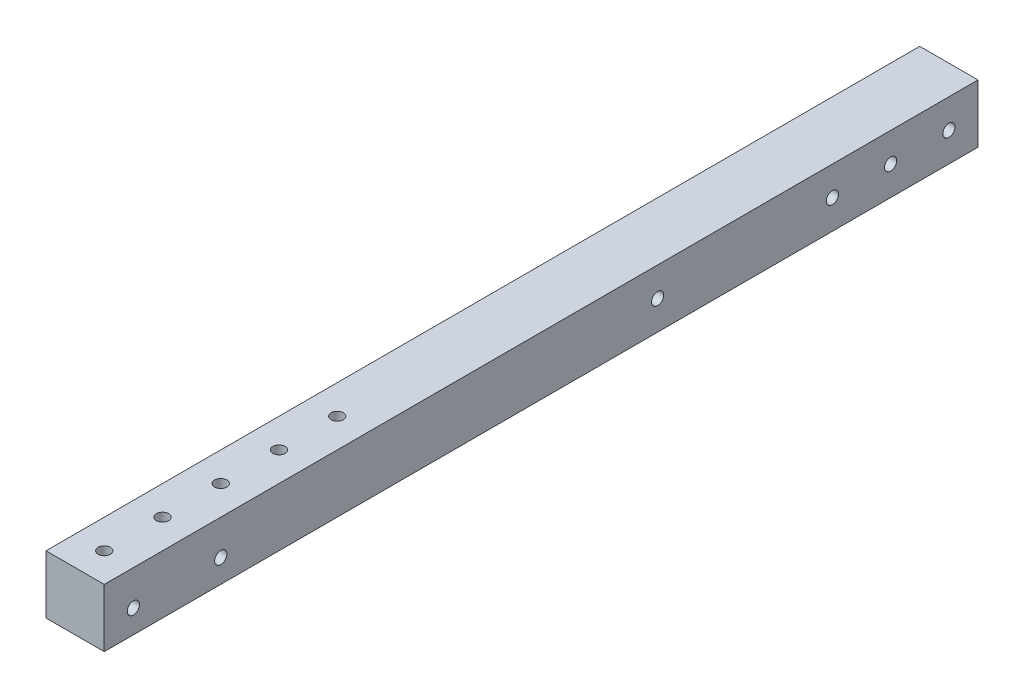
ISO-10303-21;
HEADER;
FILE_DESCRIPTION(('STEP AP214'),'2;1');
FILE_NAME('part.step','',(''),(''),'','','');
FILE_SCHEMA(('AUTOMOTIVE_DESIGN { 1 0 10303 214 1 1 1 1 }'));
ENDSEC;
DATA;
#1=APPLICATION_CONTEXT('core data for automotive mechanical design processes');
#2=APPLICATION_PROTOCOL_DEFINITION('international standard','automotive_design',2000,#1);
#3=PRODUCT_CONTEXT('',#1,'mechanical');
#4=PRODUCT('Part','Part','',(#3));
#5=PRODUCT_RELATED_PRODUCT_CATEGORY('part','',(#4));
#6=PRODUCT_DEFINITION_FORMATION('','',#4);
#7=PRODUCT_DEFINITION_CONTEXT('part definition',#1,'design');
#8=PRODUCT_DEFINITION('design','',#6,#7);
#9=PRODUCT_DEFINITION_SHAPE('','',#8);
#10=(LENGTH_UNIT() NAMED_UNIT(*) SI_UNIT(.MILLI.,.METRE.));
#11=(NAMED_UNIT(*) PLANE_ANGLE_UNIT() SI_UNIT($,.RADIAN.));
#12=(NAMED_UNIT(*) SI_UNIT($,.STERADIAN.) SOLID_ANGLE_UNIT());
#13=UNCERTAINTY_MEASURE_WITH_UNIT(LENGTH_MEASURE(1.E-05),#10,'distance_accuracy_value','');
#14=(GEOMETRIC_REPRESENTATION_CONTEXT(3) GLOBAL_UNCERTAINTY_ASSIGNED_CONTEXT((#13)) GLOBAL_UNIT_ASSIGNED_CONTEXT((#10,
#11,#12)) REPRESENTATION_CONTEXT('',''));
#15=CARTESIAN_POINT('',(0.,0.,0.));
#16=DIRECTION('',(0.,0.,1.));
#17=DIRECTION('',(1.,0.,0.));
#18=AXIS2_PLACEMENT_3D('',#15,#16,#17);
#19=CARTESIAN_POINT('',(0.,10.,290.));
#20=DIRECTION('',(0.,-1.,0.));
#21=DIRECTION('',(0.,0.,-1.));
#22=AXIS2_PLACEMENT_3D('',#19,#20,#21);
#23=CYLINDRICAL_SURFACE('',#22,2.1);
#24=CARTESIAN_POINT('',(0.,-10.,290.));
#25=DIRECTION('',(0.,-1.,0.));
#26=DIRECTION('',(0.,0.,-1.));
#27=AXIS2_PLACEMENT_3D('',#24,#25,#26);
#28=CIRCLE('',#27,2.1);
#29=CARTESIAN_POINT('',(0.,-10.,287.9));
#30=VERTEX_POINT('',#29);
#31=EDGE_CURVE('E196',#30,#30,#28,.T.);
#32=ORIENTED_EDGE('',*,*,#31,.T.);
#33=EDGE_LOOP('',(#32));
#34=FACE_BOUND('',#33,.T.);
#35=CARTESIAN_POINT('',(0.,-2.,290.));
#36=DIRECTION('',(-0.707106781186547,-0.707106781186547,0.));
#37=DIRECTION('',(0.707106781186547,-0.707106781186547,0.));
#38=AXIS2_PLACEMENT_3D('',#35,#36,#37);
#39=ELLIPSE('',#38,2.96984848098349,2.09999999999999);
#40=CARTESIAN_POINT('',(0.,-2.,292.1));
#41=VERTEX_POINT('',#40);
#42=CARTESIAN_POINT('',(0.,-2.,287.9));
#43=VERTEX_POINT('',#42);
#44=EDGE_CURVE('E53',#41,#43,#39,.F.);
#45=ORIENTED_EDGE('',*,*,#44,.T.);
#46=CARTESIAN_POINT('',(0.,-2.,290.));
#47=DIRECTION('',(0.707106781186547,-0.707106781186547,0.));
#48=DIRECTION('',(-0.707106781186547,-0.707106781186547,0.));
#49=AXIS2_PLACEMENT_3D('',#46,#47,#48);
#50=ELLIPSE('',#49,2.96984848098349,2.09999999999999);
#51=EDGE_CURVE('E11',#43,#41,#50,.F.);
#52=ORIENTED_EDGE('',*,*,#51,.T.);
#53=EDGE_LOOP('',(#45,#52));
#54=FACE_BOUND('',#53,.T.);
#55=ADVANCED_FACE('F39',(#34,#54),#23,.F.);
#56=CARTESIAN_POINT('',(10.,10.,300.));
#57=DIRECTION('',(-1.,0.,0.));
#58=DIRECTION('',(0.,0.,1.));
#59=AXIS2_PLACEMENT_3D('',#56,#57,#58);
#60=PLANE('',#59);
#61=CARTESIAN_POINT('',(10.,-2.,290.));
#62=DIRECTION('',(1.,0.,0.));
#63=DIRECTION('',(0.,0.,-1.));
#64=AXIS2_PLACEMENT_3D('',#61,#62,#63);
#65=CIRCLE('',#64,2.09999999999999);
#66=CARTESIAN_POINT('',(10.,-2.,287.9));
#67=VERTEX_POINT('',#66);
#68=EDGE_CURVE('E227',#67,#67,#65,.T.);
#69=ORIENTED_EDGE('',*,*,#68,.F.);
#70=EDGE_LOOP('',(#69));
#71=FACE_BOUND('',#70,.T.);
#72=CARTESIAN_POINT('',(10.,-2.,260.));
#73=DIRECTION('',(1.,0.,0.));
#74=DIRECTION('',(0.,0.,-1.));
#75=AXIS2_PLACEMENT_3D('',#72,#73,#74);
#76=CIRCLE('',#75,2.09999999999999);
#77=CARTESIAN_POINT('',(10.,-2.,257.9));
#78=VERTEX_POINT('',#77);
#79=EDGE_CURVE('E219',#78,#78,#76,.T.);
#80=ORIENTED_EDGE('',*,*,#79,.F.);
#81=EDGE_LOOP('',(#80));
#82=FACE_BOUND('',#81,.T.);
#83=CARTESIAN_POINT('',(10.,0.,50.));
#84=DIRECTION('',(1.,0.,0.));
#85=DIRECTION('',(0.,0.,-1.));
#86=AXIS2_PLACEMENT_3D('',#83,#84,#85);
#87=CIRCLE('',#86,2.1);
#88=CARTESIAN_POINT('',(10.,0.,47.9));
#89=VERTEX_POINT('',#88);
#90=EDGE_CURVE('E171',#89,#89,#87,.T.);
#91=ORIENTED_EDGE('',*,*,#90,.F.);
#92=EDGE_LOOP('',(#91));
#93=FACE_BOUND('',#92,.T.);
#94=CARTESIAN_POINT('',(10.,0.,110.));
#95=DIRECTION('',(1.,0.,0.));
#96=DIRECTION('',(0.,0.,-1.));
#97=AXIS2_PLACEMENT_3D('',#94,#95,#96);
#98=CIRCLE('',#97,2.09999999999999);
#99=CARTESIAN_POINT('',(10.,0.,107.9));
#100=VERTEX_POINT('',#99);
#101=EDGE_CURVE('E163',#100,#100,#98,.T.);
#102=ORIENTED_EDGE('',*,*,#101,.F.);
#103=EDGE_LOOP('',(#102));
#104=FACE_BOUND('',#103,.T.);
#105=CARTESIAN_POINT('',(10.,-1.39659253553725E-13,30.));
#106=DIRECTION('',(1.,0.,0.));
#107=DIRECTION('',(0.,0.,-1.));
#108=AXIS2_PLACEMENT_3D('',#105,#106,#107);
#109=CIRCLE('',#108,2.1);
#110=CARTESIAN_POINT('',(10.,-1.39659253553725E-13,27.9));
#111=VERTEX_POINT('',#110);
#112=EDGE_CURVE('E156',#111,#111,#109,.T.);
#113=ORIENTED_EDGE('',*,*,#112,.F.);
#114=EDGE_LOOP('',(#113));
#115=FACE_BOUND('',#114,.T.);
#116=CARTESIAN_POINT('',(10.,0.,10.));
#117=DIRECTION('',(1.,0.,0.));
#118=DIRECTION('',(0.,0.,-1.));
#119=AXIS2_PLACEMENT_3D('',#116,#117,#118);
#120=CIRCLE('',#119,2.1);
#121=CARTESIAN_POINT('',(10.,0.,7.9));
#122=VERTEX_POINT('',#121);
#123=EDGE_CURVE('E151',#122,#122,#120,.T.);
#124=ORIENTED_EDGE('',*,*,#123,.F.);
#125=EDGE_LOOP('',(#124));
#126=FACE_BOUND('',#125,.T.);
#127=DIRECTION('',(0.,1.,0.));
#128=VECTOR('',#127,1.);
#129=CARTESIAN_POINT('',(10.,10.,0.));
#130=LINE('',#129,#128);
#131=CARTESIAN_POINT('',(10.,-10.,0.));
#132=VERTEX_POINT('',#131);
#133=CARTESIAN_POINT('',(10.,10.,0.));
#134=VERTEX_POINT('',#133);
#135=EDGE_CURVE('E133',#132,#134,#130,.T.);
#136=ORIENTED_EDGE('',*,*,#135,.T.);
#137=DIRECTION('',(0.,0.,-1.));
#138=VECTOR('',#137,1.);
#139=CARTESIAN_POINT('',(10.,10.,300.));
#140=LINE('',#139,#138);
#141=CARTESIAN_POINT('',(10.,10.,300.));
#142=VERTEX_POINT('',#141);
#143=EDGE_CURVE('E106',#142,#134,#140,.T.);
#144=ORIENTED_EDGE('',*,*,#143,.F.);
#145=DIRECTION('',(0.,1.,0.));
#146=VECTOR('',#145,1.);
#147=CARTESIAN_POINT('',(10.,10.,300.));
#148=LINE('',#147,#146);
#149=CARTESIAN_POINT('',(10.,-10.,300.));
#150=VERTEX_POINT('',#149);
#151=EDGE_CURVE('E126',#150,#142,#148,.T.);
#152=ORIENTED_EDGE('',*,*,#151,.F.);
#153=DIRECTION('',(0.,0.,-1.));
#154=VECTOR('',#153,1.);
#155=CARTESIAN_POINT('',(10.,-10.,300.));
#156=LINE('',#155,#154);
#157=EDGE_CURVE('E121',#150,#132,#156,.T.);
#158=ORIENTED_EDGE('',*,*,#157,.T.);
#159=EDGE_LOOP('',(#136,#144,#152,#158));
#160=FACE_BOUND('',#159,.T.);
#161=ADVANCED_FACE('F41',(#71,#82,#93,#104,#115,#126,#160),#60,.F.);
#162=CARTESIAN_POINT('',(-10.,10.,300.));
#163=DIRECTION('',(0.,-1.,0.));
#164=DIRECTION('',(0.,0.,-1.));
#165=AXIS2_PLACEMENT_3D('',#162,#163,#164);
#166=PLANE('',#165);
#167=CARTESIAN_POINT('',(0.,10.,290.));
#168=DIRECTION('',(0.,-1.,0.));
#169=DIRECTION('',(0.,0.,-1.));
#170=AXIS2_PLACEMENT_3D('',#167,#168,#169);
#171=CIRCLE('',#170,2.1);
#172=CARTESIAN_POINT('',(0.,10.,287.9));
#173=VERTEX_POINT('',#172);
#174=EDGE_CURVE('E175',#173,#173,#171,.T.);
#175=ORIENTED_EDGE('',*,*,#174,.T.);
#176=EDGE_LOOP('',(#175));
#177=FACE_BOUND('',#176,.T.);
#178=CARTESIAN_POINT('',(8.33056934125762E-13,10.,210.));
#179=DIRECTION('',(0.,-1.,0.));
#180=DIRECTION('',(0.,0.,-1.));
#181=AXIS2_PLACEMENT_3D('',#178,#179,#180);
#182=CIRCLE('',#181,2.1);
#183=CARTESIAN_POINT('',(8.33056934125762E-13,10.,207.9));
#184=VERTEX_POINT('',#183);
#185=EDGE_CURVE('E201',#184,#184,#182,.T.);
#186=ORIENTED_EDGE('',*,*,#185,.T.);
#187=EDGE_LOOP('',(#186));
#188=FACE_BOUND('',#187,.T.);
#189=CARTESIAN_POINT('',(4.16528467062881E-13,10.,250.));
#190=DIRECTION('',(0.,-1.,0.));
#191=DIRECTION('',(0.,0.,-1.));
#192=AXIS2_PLACEMENT_3D('',#189,#190,#191);
#193=CIRCLE('',#192,2.1);
#194=CARTESIAN_POINT('',(4.16528467062881E-13,10.,247.9));
#195=VERTEX_POINT('',#194);
#196=EDGE_CURVE('E184',#195,#195,#193,.T.);
#197=ORIENTED_EDGE('',*,*,#196,.T.);
#198=EDGE_LOOP('',(#197));
#199=FACE_BOUND('',#198,.T.);
#200=CARTESIAN_POINT('',(2.08264233531441E-13,10.,270.));
#201=DIRECTION('',(0.,-1.,0.));
#202=DIRECTION('',(0.,0.,-1.));
#203=AXIS2_PLACEMENT_3D('',#200,#201,#202);
#204=CIRCLE('',#203,2.1);
#205=CARTESIAN_POINT('',(2.08264233531441E-13,10.,267.9));
#206=VERTEX_POINT('',#205);
#207=EDGE_CURVE('E183',#206,#206,#204,.T.);
#208=ORIENTED_EDGE('',*,*,#207,.T.);
#209=EDGE_LOOP('',(#208));
#210=FACE_BOUND('',#209,.T.);
#211=CARTESIAN_POINT('',(6.24792700594322E-13,10.,230.));
#212=DIRECTION('',(0.,-1.,0.));
#213=DIRECTION('',(0.,0.,-1.));
#214=AXIS2_PLACEMENT_3D('',#211,#212,#213);
#215=CIRCLE('',#214,2.1);
#216=CARTESIAN_POINT('',(6.24792700594322E-13,10.,227.9));
#217=VERTEX_POINT('',#216);
#218=EDGE_CURVE('E192',#217,#217,#215,.T.);
#219=ORIENTED_EDGE('',*,*,#218,.T.);
#220=EDGE_LOOP('',(#219));
#221=FACE_BOUND('',#220,.T.);
#222=DIRECTION('',(-1.,0.,0.));
#223=VECTOR('',#222,1.);
#224=CARTESIAN_POINT('',(-10.,10.,0.));
#225=LINE('',#224,#223);
#226=CARTESIAN_POINT('',(-10.,10.,0.));
#227=VERTEX_POINT('',#226);
#228=EDGE_CURVE('E130',#134,#227,#225,.T.);
#229=ORIENTED_EDGE('',*,*,#228,.T.);
#230=DIRECTION('',(0.,0.,-1.));
#231=VECTOR('',#230,1.);
#232=CARTESIAN_POINT('',(-10.,10.,300.));
#233=LINE('',#232,#231);
#234=CARTESIAN_POINT('',(-10.,10.,300.));
#235=VERTEX_POINT('',#234);
#236=EDGE_CURVE('E114',#235,#227,#233,.T.);
#237=ORIENTED_EDGE('',*,*,#236,.F.);
#238=DIRECTION('',(-1.,0.,0.));
#239=VECTOR('',#238,1.);
#240=CARTESIAN_POINT('',(-10.,10.,300.));
#241=LINE('',#240,#239);
#242=EDGE_CURVE('E91',#142,#235,#241,.T.);
#243=ORIENTED_EDGE('',*,*,#242,.F.);
#244=ORIENTED_EDGE('',*,*,#143,.T.);
#245=EDGE_LOOP('',(#229,#237,#243,#244));
#246=FACE_BOUND('',#245,.T.);
#247=ADVANCED_FACE('F254',(#177,#188,#199,#210,#221,#246),#166,.F.);
#248=CARTESIAN_POINT('',(-10.,10.,300.));
#249=DIRECTION('',(1.,0.,0.));
#250=DIRECTION('',(0.,1.,0.));
#251=AXIS2_PLACEMENT_3D('',#248,#249,#250);
#252=PLANE('',#251);
#253=CARTESIAN_POINT('',(-10.,-2.,290.));
#254=DIRECTION('',(1.,0.,0.));
#255=DIRECTION('',(0.,0.,-1.));
#256=AXIS2_PLACEMENT_3D('',#253,#254,#255);
#257=CIRCLE('',#256,2.09999999999999);
#258=CARTESIAN_POINT('',(-10.,-2.,287.9));
#259=VERTEX_POINT('',#258);
#260=EDGE_CURVE('E202',#259,#259,#257,.T.);
#261=ORIENTED_EDGE('',*,*,#260,.T.);
#262=EDGE_LOOP('',(#261));
#263=FACE_BOUND('',#262,.T.);
#264=CARTESIAN_POINT('',(-10.,-2.,260.));
#265=DIRECTION('',(1.,0.,0.));
#266=DIRECTION('',(0.,0.,-1.));
#267=AXIS2_PLACEMENT_3D('',#264,#265,#266);
#268=CIRCLE('',#267,2.09999999999999);
#269=CARTESIAN_POINT('',(-10.,-2.,257.9));
#270=VERTEX_POINT('',#269);
#271=EDGE_CURVE('E223',#270,#270,#268,.T.);
#272=ORIENTED_EDGE('',*,*,#271,.T.);
#273=EDGE_LOOP('',(#272));
#274=FACE_BOUND('',#273,.T.);
#275=CARTESIAN_POINT('',(-10.,0.,50.));
#276=DIRECTION('',(1.,0.,0.));
#277=DIRECTION('',(0.,0.,-1.));
#278=AXIS2_PLACEMENT_3D('',#275,#276,#277);
#279=CIRCLE('',#278,2.1);
#280=CARTESIAN_POINT('',(-10.,0.,47.9));
#281=VERTEX_POINT('',#280);
#282=EDGE_CURVE('E167',#281,#281,#279,.T.);
#283=ORIENTED_EDGE('',*,*,#282,.T.);
#284=EDGE_LOOP('',(#283));
#285=FACE_BOUND('',#284,.T.);
#286=CARTESIAN_POINT('',(-10.,0.,110.));
#287=DIRECTION('',(1.,0.,0.));
#288=DIRECTION('',(0.,0.,-1.));
#289=AXIS2_PLACEMENT_3D('',#286,#287,#288);
#290=CIRCLE('',#289,2.09999999999999);
#291=CARTESIAN_POINT('',(-10.,0.,107.9));
#292=VERTEX_POINT('',#291);
#293=EDGE_CURVE('E152',#292,#292,#290,.T.);
#294=ORIENTED_EDGE('',*,*,#293,.T.);
#295=EDGE_LOOP('',(#294));
#296=FACE_BOUND('',#295,.T.);
#297=CARTESIAN_POINT('',(-10.,-1.39659253553725E-13,30.));
#298=DIRECTION('',(1.,0.,0.));
#299=DIRECTION('',(0.,0.,-1.));
#300=AXIS2_PLACEMENT_3D('',#297,#298,#299);
#301=CIRCLE('',#300,2.1);
#302=CARTESIAN_POINT('',(-10.,-1.39659253553725E-13,27.9));
#303=VERTEX_POINT('',#302);
#304=EDGE_CURVE('E137',#303,#303,#301,.T.);
#305=ORIENTED_EDGE('',*,*,#304,.T.);
#306=EDGE_LOOP('',(#305));
#307=FACE_BOUND('',#306,.T.);
#308=CARTESIAN_POINT('',(-10.,0.,10.));
#309=DIRECTION('',(1.,0.,0.));
#310=DIRECTION('',(0.,0.,-1.));
#311=AXIS2_PLACEMENT_3D('',#308,#309,#310);
#312=CIRCLE('',#311,2.1);
#313=CARTESIAN_POINT('',(-10.,0.,7.9));
#314=VERTEX_POINT('',#313);
#315=EDGE_CURVE('E147',#314,#314,#312,.T.);
#316=ORIENTED_EDGE('',*,*,#315,.T.);
#317=EDGE_LOOP('',(#316));
#318=FACE_BOUND('',#317,.T.);
#319=DIRECTION('',(0.,-1.,0.));
#320=VECTOR('',#319,1.);
#321=CARTESIAN_POINT('',(-10.,10.,0.));
#322=LINE('',#321,#320);
#323=CARTESIAN_POINT('',(-10.,-10.,0.));
#324=VERTEX_POINT('',#323);
#325=EDGE_CURVE('E127',#227,#324,#322,.T.);
#326=ORIENTED_EDGE('',*,*,#325,.T.);
#327=DIRECTION('',(0.,0.,-1.));
#328=VECTOR('',#327,1.);
#329=CARTESIAN_POINT('',(-10.,-10.,300.));
#330=LINE('',#329,#328);
#331=CARTESIAN_POINT('',(-10.,-10.,300.));
#332=VERTEX_POINT('',#331);
#333=EDGE_CURVE('E118',#332,#324,#330,.T.);
#334=ORIENTED_EDGE('',*,*,#333,.F.);
#335=DIRECTION('',(0.,-1.,0.));
#336=VECTOR('',#335,1.);
#337=CARTESIAN_POINT('',(-10.,10.,300.));
#338=LINE('',#337,#336);
#339=EDGE_CURVE('E140',#235,#332,#338,.T.);
#340=ORIENTED_EDGE('',*,*,#339,.F.);
#341=ORIENTED_EDGE('',*,*,#236,.T.);
#342=EDGE_LOOP('',(#326,#334,#340,#341));
#343=FACE_BOUND('',#342,.T.);
#344=ADVANCED_FACE('F235',(#263,#274,#285,#296,#307,#318,#343),#252,.F.);
#345=CARTESIAN_POINT('',(-10.,-10.,300.));
#346=DIRECTION('',(0.,1.,0.));
#347=DIRECTION('',(0.,0.,1.));
#348=AXIS2_PLACEMENT_3D('',#345,#346,#347);
#349=PLANE('',#348);
#350=ORIENTED_EDGE('',*,*,#31,.F.);
#351=EDGE_LOOP('',(#350));
#352=FACE_BOUND('',#351,.T.);
#353=CARTESIAN_POINT('',(8.33056934125762E-13,-10.,210.));
#354=DIRECTION('',(0.,-1.,0.));
#355=DIRECTION('',(0.,0.,-1.));
#356=AXIS2_PLACEMENT_3D('',#353,#354,#355);
#357=CIRCLE('',#356,2.1);
#358=CARTESIAN_POINT('',(8.33056934125762E-13,-10.,207.9));
#359=VERTEX_POINT('',#358);
#360=EDGE_CURVE('E197',#359,#359,#357,.T.);
#361=ORIENTED_EDGE('',*,*,#360,.F.);
#362=EDGE_LOOP('',(#361));
#363=FACE_BOUND('',#362,.T.);
#364=CARTESIAN_POINT('',(4.16528467062881E-13,-10.,250.));
#365=DIRECTION('',(0.,-1.,0.));
#366=DIRECTION('',(0.,0.,-1.));
#367=AXIS2_PLACEMENT_3D('',#364,#365,#366);
#368=CIRCLE('',#367,2.1);
#369=CARTESIAN_POINT('',(4.16528467062881E-13,-10.,247.9));
#370=VERTEX_POINT('',#369);
#371=EDGE_CURVE('E206',#370,#370,#368,.T.);
#372=ORIENTED_EDGE('',*,*,#371,.F.);
#373=EDGE_LOOP('',(#372));
#374=FACE_BOUND('',#373,.T.);
#375=CARTESIAN_POINT('',(2.08264233531441E-13,-10.,270.));
#376=DIRECTION('',(0.,-1.,0.));
#377=DIRECTION('',(0.,0.,-1.));
#378=AXIS2_PLACEMENT_3D('',#375,#376,#377);
#379=CIRCLE('',#378,2.1);
#380=CARTESIAN_POINT('',(2.08264233531441E-13,-10.,267.9));
#381=VERTEX_POINT('',#380);
#382=EDGE_CURVE('E179',#381,#381,#379,.T.);
#383=ORIENTED_EDGE('',*,*,#382,.F.);
#384=EDGE_LOOP('',(#383));
#385=FACE_BOUND('',#384,.T.);
#386=CARTESIAN_POINT('',(6.24792700594322E-13,-10.,230.));
#387=DIRECTION('',(0.,-1.,0.));
#388=DIRECTION('',(0.,0.,-1.));
#389=AXIS2_PLACEMENT_3D('',#386,#387,#388);
#390=CIRCLE('',#389,2.1);
#391=CARTESIAN_POINT('',(6.24792700594322E-13,-10.,227.9));
#392=VERTEX_POINT('',#391);
#393=EDGE_CURVE('E188',#392,#392,#390,.T.);
#394=ORIENTED_EDGE('',*,*,#393,.F.);
#395=EDGE_LOOP('',(#394));
#396=FACE_BOUND('',#395,.T.);
#397=DIRECTION('',(1.,0.,0.));
#398=VECTOR('',#397,1.);
#399=CARTESIAN_POINT('',(-10.,-10.,0.));
#400=LINE('',#399,#398);
#401=EDGE_CURVE('E83',#324,#132,#400,.T.);
#402=ORIENTED_EDGE('',*,*,#401,.T.);
#403=ORIENTED_EDGE('',*,*,#157,.F.);
#404=DIRECTION('',(1.,0.,0.));
#405=VECTOR('',#404,1.);
#406=CARTESIAN_POINT('',(-10.,-10.,300.));
#407=LINE('',#406,#405);
#408=EDGE_CURVE('E62',#332,#150,#407,.T.);
#409=ORIENTED_EDGE('',*,*,#408,.F.);
#410=ORIENTED_EDGE('',*,*,#333,.T.);
#411=EDGE_LOOP('',(#402,#403,#409,#410));
#412=FACE_BOUND('',#411,.T.);
#413=ADVANCED_FACE('F300',(#352,#363,#374,#385,#396,#412),#349,.F.);
#414=CARTESIAN_POINT('',(0.,0.,300.));
#415=DIRECTION('',(0.,0.,1.));
#416=DIRECTION('',(1.,0.,0.));
#417=AXIS2_PLACEMENT_3D('',#414,#415,#416);
#418=PLANE('',#417);
#419=ORIENTED_EDGE('',*,*,#151,.T.);
#420=ORIENTED_EDGE('',*,*,#242,.T.);
#421=ORIENTED_EDGE('',*,*,#339,.T.);
#422=ORIENTED_EDGE('',*,*,#408,.T.);
#423=EDGE_LOOP('',(#419,#420,#421,#422));
#424=FACE_BOUND('',#423,.T.);
#425=ADVANCED_FACE('F297',(#424),#418,.T.);
#426=CARTESIAN_POINT('',(0.,0.,0.));
#427=DIRECTION('',(0.,0.,1.));
#428=DIRECTION('',(1.,0.,0.));
#429=AXIS2_PLACEMENT_3D('',#426,#427,#428);
#430=PLANE('',#429);
#431=ORIENTED_EDGE('',*,*,#135,.F.);
#432=ORIENTED_EDGE('',*,*,#401,.F.);
#433=ORIENTED_EDGE('',*,*,#325,.F.);
#434=ORIENTED_EDGE('',*,*,#228,.F.);
#435=EDGE_LOOP('',(#431,#432,#433,#434));
#436=FACE_BOUND('',#435,.T.);
#437=ADVANCED_FACE('F295',(#436),#430,.F.);
#438=CARTESIAN_POINT('',(-10.,0.,10.));
#439=DIRECTION('',(1.,0.,0.));
#440=DIRECTION('',(0.,0.,-1.));
#441=AXIS2_PLACEMENT_3D('',#438,#439,#440);
#442=CYLINDRICAL_SURFACE('',#441,2.1);
#443=ORIENTED_EDGE('',*,*,#315,.F.);
#444=EDGE_LOOP('',(#443));
#445=FACE_BOUND('',#444,.T.);
#446=ORIENTED_EDGE('',*,*,#123,.T.);
#447=EDGE_LOOP('',(#446));
#448=FACE_BOUND('',#447,.T.);
#449=ADVANCED_FACE('F291',(#445,#448),#442,.F.);
#450=CARTESIAN_POINT('',(-10.,-1.39659253553725E-13,30.));
#451=DIRECTION('',(1.,0.,0.));
#452=DIRECTION('',(0.,0.,-1.));
#453=AXIS2_PLACEMENT_3D('',#450,#451,#452);
#454=CYLINDRICAL_SURFACE('',#453,2.1);
#455=ORIENTED_EDGE('',*,*,#304,.F.);
#456=EDGE_LOOP('',(#455));
#457=FACE_BOUND('',#456,.T.);
#458=ORIENTED_EDGE('',*,*,#112,.T.);
#459=EDGE_LOOP('',(#458));
#460=FACE_BOUND('',#459,.T.);
#461=ADVANCED_FACE('F287',(#457,#460),#454,.F.);
#462=CARTESIAN_POINT('',(-10.,0.,110.));
#463=DIRECTION('',(1.,0.,0.));
#464=DIRECTION('',(0.,0.,-1.));
#465=AXIS2_PLACEMENT_3D('',#462,#463,#464);
#466=CYLINDRICAL_SURFACE('',#465,2.09999999999999);
#467=ORIENTED_EDGE('',*,*,#293,.F.);
#468=EDGE_LOOP('',(#467));
#469=FACE_BOUND('',#468,.T.);
#470=ORIENTED_EDGE('',*,*,#101,.T.);
#471=EDGE_LOOP('',(#470));
#472=FACE_BOUND('',#471,.T.);
#473=ADVANCED_FACE('F283',(#469,#472),#466,.F.);
#474=CARTESIAN_POINT('',(-10.,0.,50.));
#475=DIRECTION('',(1.,0.,0.));
#476=DIRECTION('',(0.,0.,-1.));
#477=AXIS2_PLACEMENT_3D('',#474,#475,#476);
#478=CYLINDRICAL_SURFACE('',#477,2.1);
#479=ORIENTED_EDGE('',*,*,#282,.F.);
#480=EDGE_LOOP('',(#479));
#481=FACE_BOUND('',#480,.T.);
#482=ORIENTED_EDGE('',*,*,#90,.T.);
#483=EDGE_LOOP('',(#482));
#484=FACE_BOUND('',#483,.T.);
#485=ADVANCED_FACE('F276',(#481,#484),#478,.F.);
#486=CARTESIAN_POINT('',(6.24792700594322E-13,10.,230.));
#487=DIRECTION('',(0.,-1.,0.));
#488=DIRECTION('',(0.,0.,-1.));
#489=AXIS2_PLACEMENT_3D('',#486,#487,#488);
#490=CYLINDRICAL_SURFACE('',#489,2.1);
#491=ORIENTED_EDGE('',*,*,#218,.F.);
#492=EDGE_LOOP('',(#491));
#493=FACE_BOUND('',#492,.T.);
#494=ORIENTED_EDGE('',*,*,#393,.T.);
#495=EDGE_LOOP('',(#494));
#496=FACE_BOUND('',#495,.T.);
#497=ADVANCED_FACE('F273',(#493,#496),#490,.F.);
#498=CARTESIAN_POINT('',(2.08264233531441E-13,10.,270.));
#499=DIRECTION('',(0.,-1.,0.));
#500=DIRECTION('',(0.,0.,-1.));
#501=AXIS2_PLACEMENT_3D('',#498,#499,#500);
#502=CYLINDRICAL_SURFACE('',#501,2.1);
#503=ORIENTED_EDGE('',*,*,#207,.F.);
#504=EDGE_LOOP('',(#503));
#505=FACE_BOUND('',#504,.T.);
#506=ORIENTED_EDGE('',*,*,#382,.T.);
#507=EDGE_LOOP('',(#506));
#508=FACE_BOUND('',#507,.T.);
#509=ADVANCED_FACE('F268',(#505,#508),#502,.F.);
#510=CARTESIAN_POINT('',(4.16528467062881E-13,10.,250.));
#511=DIRECTION('',(0.,-1.,0.));
#512=DIRECTION('',(0.,0.,-1.));
#513=AXIS2_PLACEMENT_3D('',#510,#511,#512);
#514=CYLINDRICAL_SURFACE('',#513,2.1);
#515=ORIENTED_EDGE('',*,*,#196,.F.);
#516=EDGE_LOOP('',(#515));
#517=FACE_BOUND('',#516,.T.);
#518=ORIENTED_EDGE('',*,*,#371,.T.);
#519=EDGE_LOOP('',(#518));
#520=FACE_BOUND('',#519,.T.);
#521=ADVANCED_FACE('F262',(#517,#520),#514,.F.);
#522=CARTESIAN_POINT('',(8.33056934125762E-13,10.,210.));
#523=DIRECTION('',(0.,-1.,0.));
#524=DIRECTION('',(0.,0.,-1.));
#525=AXIS2_PLACEMENT_3D('',#522,#523,#524);
#526=CYLINDRICAL_SURFACE('',#525,2.1);
#527=ORIENTED_EDGE('',*,*,#185,.F.);
#528=EDGE_LOOP('',(#527));
#529=FACE_BOUND('',#528,.T.);
#530=ORIENTED_EDGE('',*,*,#360,.T.);
#531=EDGE_LOOP('',(#530));
#532=FACE_BOUND('',#531,.T.);
#533=ADVANCED_FACE('F258',(#529,#532),#526,.F.);
#534=CARTESIAN_POINT('',(0.,-2.,290.));
#535=DIRECTION('',(-0.707106781186547,-0.707106781186547,0.));
#536=DIRECTION('',(0.707106781186547,-0.707106781186547,0.));
#537=AXIS2_PLACEMENT_3D('',#534,#535,#536);
#538=ELLIPSE('',#537,2.96984848098349,2.09999999999999);
#539=EDGE_CURVE('E97',#41,#43,#538,.T.);
#540=ORIENTED_EDGE('',*,*,#539,.T.);
#541=CARTESIAN_POINT('',(0.,-2.,290.));
#542=DIRECTION('',(0.707106781186547,-0.707106781186547,0.));
#543=DIRECTION('',(-0.707106781186547,-0.707106781186547,0.));
#544=AXIS2_PLACEMENT_3D('',#541,#542,#543);
#545=ELLIPSE('',#544,2.96984848098349,2.09999999999999);
#546=EDGE_CURVE('E48',#43,#41,#545,.T.);
#547=ORIENTED_EDGE('',*,*,#546,.T.);
#548=EDGE_LOOP('',(#540,#547));
#549=FACE_BOUND('',#548,.T.);
#550=ORIENTED_EDGE('',*,*,#174,.F.);
#551=EDGE_LOOP('',(#550));
#552=FACE_BOUND('',#551,.T.);
#553=ADVANCED_FACE('F108',(#549,#552),#23,.F.);
#554=CARTESIAN_POINT('',(-10.,-2.,290.));
#555=DIRECTION('',(1.,0.,0.));
#556=DIRECTION('',(0.,0.,-1.));
#557=AXIS2_PLACEMENT_3D('',#554,#555,#556);
#558=CYLINDRICAL_SURFACE('',#557,2.09999999999999);
#559=ORIENTED_EDGE('',*,*,#68,.T.);
#560=EDGE_LOOP('',(#559));
#561=FACE_BOUND('',#560,.T.);
#562=ORIENTED_EDGE('',*,*,#44,.F.);
#563=ORIENTED_EDGE('',*,*,#546,.F.);
#564=EDGE_LOOP('',(#562,#563));
#565=FACE_BOUND('',#564,.T.);
#566=ADVANCED_FACE('F104',(#561,#565),#558,.F.);
#567=ORIENTED_EDGE('',*,*,#260,.F.);
#568=EDGE_LOOP('',(#567));
#569=FACE_BOUND('',#568,.T.);
#570=ORIENTED_EDGE('',*,*,#539,.F.);
#571=ORIENTED_EDGE('',*,*,#51,.F.);
#572=EDGE_LOOP('',(#570,#571));
#573=FACE_BOUND('',#572,.T.);
#574=ADVANCED_FACE('F98',(#569,#573),#558,.F.);
#575=CARTESIAN_POINT('',(-10.,-2.,260.));
#576=DIRECTION('',(1.,0.,0.));
#577=DIRECTION('',(0.,0.,-1.));
#578=AXIS2_PLACEMENT_3D('',#575,#576,#577);
#579=CYLINDRICAL_SURFACE('',#578,2.09999999999999);
#580=ORIENTED_EDGE('',*,*,#271,.F.);
#581=EDGE_LOOP('',(#580));
#582=FACE_BOUND('',#581,.T.);
#583=ORIENTED_EDGE('',*,*,#79,.T.);
#584=EDGE_LOOP('',(#583));
#585=FACE_BOUND('',#584,.T.);
#586=ADVANCED_FACE('F239',(#582,#585),#579,.F.);
#587=CLOSED_SHELL('',(#55,#161,#247,#344,#413,#425,#437,#449,#461,#473,#485,#497,#509,#521,#533,
#553,#566,#574,#586));
#588=MANIFOLD_SOLID_BREP('B2',#587);
#589=ADVANCED_BREP_SHAPE_REPRESENTATION('',(#18,#588),#14);
#590=SHAPE_DEFINITION_REPRESENTATION(#9,#589);
ENDSEC;
END-ISO-10303-21;
